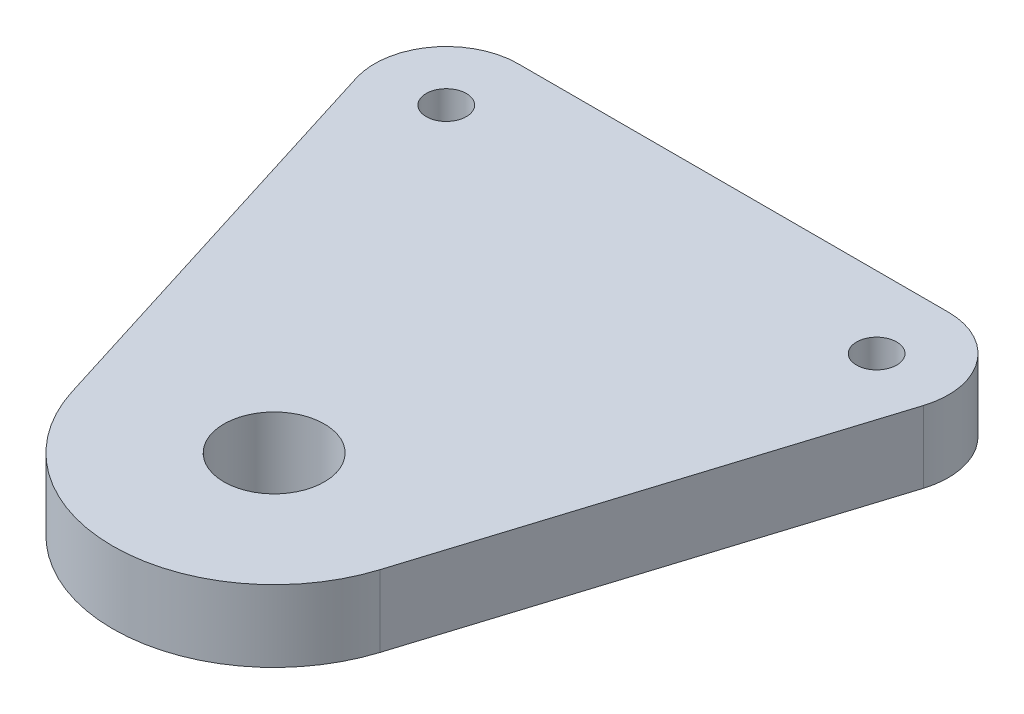
ISO-10303-21;
HEADER;
FILE_DESCRIPTION(('STEP AP214'),'2;1');
FILE_NAME('part.step','',(''),(''),'','','');
FILE_SCHEMA(('AUTOMOTIVE_DESIGN { 1 0 10303 214 1 1 1 1 }'));
ENDSEC;
DATA;
#1=APPLICATION_CONTEXT('core data for automotive mechanical design processes');
#2=APPLICATION_PROTOCOL_DEFINITION('international standard','automotive_design',2000,#1);
#3=PRODUCT_CONTEXT('',#1,'mechanical');
#4=PRODUCT('Part','Part','',(#3));
#5=PRODUCT_RELATED_PRODUCT_CATEGORY('part','',(#4));
#6=PRODUCT_DEFINITION_FORMATION('','',#4);
#7=PRODUCT_DEFINITION_CONTEXT('part definition',#1,'design');
#8=PRODUCT_DEFINITION('design','',#6,#7);
#9=PRODUCT_DEFINITION_SHAPE('','',#8);
#10=(LENGTH_UNIT() NAMED_UNIT(*) SI_UNIT(.MILLI.,.METRE.));
#11=(NAMED_UNIT(*) PLANE_ANGLE_UNIT() SI_UNIT($,.RADIAN.));
#12=(NAMED_UNIT(*) SI_UNIT($,.STERADIAN.) SOLID_ANGLE_UNIT());
#13=UNCERTAINTY_MEASURE_WITH_UNIT(LENGTH_MEASURE(1.E-05),#10,'distance_accuracy_value','');
#14=(GEOMETRIC_REPRESENTATION_CONTEXT(3) GLOBAL_UNCERTAINTY_ASSIGNED_CONTEXT((#13)) GLOBAL_UNIT_ASSIGNED_CONTEXT((#10,
#11,#12)) REPRESENTATION_CONTEXT('',''));
#15=CARTESIAN_POINT('',(0.,0.,0.));
#16=DIRECTION('',(0.,0.,1.));
#17=DIRECTION('',(1.,0.,0.));
#18=AXIS2_PLACEMENT_3D('',#15,#16,#17);
#19=CARTESIAN_POINT('',(-15.,5.,-27.));
#20=DIRECTION('',(0.,1.,0.));
#21=DIRECTION('',(0.,0.,1.));
#22=AXIS2_PLACEMENT_3D('',#19,#20,#21);
#23=PLANE('',#22);
#24=CARTESIAN_POINT('',(-15.,5.,-27.));
#25=DIRECTION('',(0.,1.,0.));
#26=DIRECTION('',(0.,0.,1.));
#27=AXIS2_PLACEMENT_3D('',#24,#25,#26);
#28=CIRCLE('',#27,1.4);
#29=CARTESIAN_POINT('',(-15.,5.,-25.6));
#30=VERTEX_POINT('',#29);
#31=EDGE_CURVE('E207',#30,#30,#28,.T.);
#32=ORIENTED_EDGE('',*,*,#31,.F.);
#33=EDGE_LOOP('',(#32));
#34=FACE_BOUND('',#33,.T.);
#35=CARTESIAN_POINT('',(-15.,5.,-27.));
#36=DIRECTION('',(0.,1.,0.));
#37=DIRECTION('',(0.,0.,1.));
#38=AXIS2_PLACEMENT_3D('',#35,#36,#37);
#39=CIRCLE('',#38,5.);
#40=CARTESIAN_POINT('',(-15.,5.,-32.));
#41=VERTEX_POINT('',#40);
#42=CARTESIAN_POINT('',(-19.7717201937673,5.,-25.5064517442033));
#43=VERTEX_POINT('',#42);
#44=EDGE_CURVE('E146',#41,#43,#39,.T.);
#45=ORIENTED_EDGE('',*,*,#44,.T.);
#46=DIRECTION('',(0.298709651159331,0.,0.954344038753463));
#47=VECTOR('',#46,1.);
#48=CARTESIAN_POINT('',(-10.7363704359765,5.,3.36048357554248));
#49=LINE('',#48,#47);
#50=CARTESIAN_POINT('',(-10.7363704359765,5.,3.36048357554247));
#51=VERTEX_POINT('',#50);
#52=EDGE_CURVE('E94',#43,#51,#49,.T.);
#53=ORIENTED_EDGE('',*,*,#52,.T.);
#54=CARTESIAN_POINT('',(0.,5.,0.));
#55=DIRECTION('',(0.,1.,0.));
#56=DIRECTION('',(0.,0.,1.));
#57=AXIS2_PLACEMENT_3D('',#54,#55,#56);
#58=CIRCLE('',#57,11.25);
#59=CARTESIAN_POINT('',(10.7363704359765,5.,3.36048357554248));
#60=VERTEX_POINT('',#59);
#61=EDGE_CURVE('E107',#51,#60,#58,.T.);
#62=ORIENTED_EDGE('',*,*,#61,.T.);
#63=DIRECTION('',(0.298709651159331,0.,-0.954344038753463));
#64=VECTOR('',#63,1.);
#65=CARTESIAN_POINT('',(19.7717201937673,5.,-25.5064517442033));
#66=LINE('',#65,#64);
#67=CARTESIAN_POINT('',(19.7717201937673,5.,-25.5064517442033));
#68=VERTEX_POINT('',#67);
#69=EDGE_CURVE('E101',#60,#68,#66,.T.);
#70=ORIENTED_EDGE('',*,*,#69,.T.);
#71=CARTESIAN_POINT('',(15.,5.,-27.));
#72=DIRECTION('',(0.,1.,0.));
#73=DIRECTION('',(0.,0.,1.));
#74=AXIS2_PLACEMENT_3D('',#71,#72,#73);
#75=CIRCLE('',#74,5.);
#76=CARTESIAN_POINT('',(15.,5.,-32.));
#77=VERTEX_POINT('',#76);
#78=EDGE_CURVE('E105',#68,#77,#75,.T.);
#79=ORIENTED_EDGE('',*,*,#78,.T.);
#80=DIRECTION('',(-1.,0.,0.));
#81=VECTOR('',#80,1.);
#82=CARTESIAN_POINT('',(-15.,5.,-32.));
#83=LINE('',#82,#81);
#84=EDGE_CURVE('E57',#77,#41,#83,.T.);
#85=ORIENTED_EDGE('',*,*,#84,.T.);
#86=EDGE_LOOP('',(#45,#53,#62,#70,#79,#85));
#87=FACE_BOUND('',#86,.T.);
#88=CARTESIAN_POINT('',(0.,5.,0.));
#89=DIRECTION('',(0.,1.,0.));
#90=DIRECTION('',(0.,0.,1.));
#91=AXIS2_PLACEMENT_3D('',#88,#89,#90);
#92=CIRCLE('',#91,3.5);
#93=CARTESIAN_POINT('',(0.,5.,3.5));
#94=VERTEX_POINT('',#93);
#95=EDGE_CURVE('E134',#94,#94,#92,.T.);
#96=ORIENTED_EDGE('',*,*,#95,.F.);
#97=EDGE_LOOP('',(#96));
#98=FACE_BOUND('',#97,.T.);
#99=CARTESIAN_POINT('',(15.,5.,-27.));
#100=DIRECTION('',(0.,1.,0.));
#101=DIRECTION('',(0.,0.,1.));
#102=AXIS2_PLACEMENT_3D('',#99,#100,#101);
#103=CIRCLE('',#102,1.4);
#104=CARTESIAN_POINT('',(15.,5.,-25.6));
#105=VERTEX_POINT('',#104);
#106=EDGE_CURVE('E196',#105,#105,#103,.T.);
#107=ORIENTED_EDGE('',*,*,#106,.F.);
#108=EDGE_LOOP('',(#107));
#109=FACE_BOUND('',#108,.T.);
#110=ADVANCED_FACE('F39',(#34,#87,#98,#109),#23,.T.);
#111=CARTESIAN_POINT('',(-15.,0.,-27.));
#112=DIRECTION('',(0.,1.,0.));
#113=DIRECTION('',(0.,0.,1.));
#114=AXIS2_PLACEMENT_3D('',#111,#112,#113);
#115=PLANE('',#114);
#116=CARTESIAN_POINT('',(-15.,0.,-27.));
#117=DIRECTION('',(0.,1.,0.));
#118=DIRECTION('',(0.,0.,1.));
#119=AXIS2_PLACEMENT_3D('',#116,#117,#118);
#120=CIRCLE('',#119,5.);
#121=CARTESIAN_POINT('',(-15.,0.,-32.));
#122=VERTEX_POINT('',#121);
#123=CARTESIAN_POINT('',(-19.7717201937673,0.,-25.5064517442033));
#124=VERTEX_POINT('',#123);
#125=EDGE_CURVE('E129',#122,#124,#120,.T.);
#126=ORIENTED_EDGE('',*,*,#125,.F.);
#127=DIRECTION('',(-1.,0.,0.));
#128=VECTOR('',#127,1.);
#129=CARTESIAN_POINT('',(-15.,0.,-32.));
#130=LINE('',#129,#128);
#131=CARTESIAN_POINT('',(15.,0.,-32.));
#132=VERTEX_POINT('',#131);
#133=EDGE_CURVE('E86',#132,#122,#130,.T.);
#134=ORIENTED_EDGE('',*,*,#133,.F.);
#135=CARTESIAN_POINT('',(15.,0.,-27.));
#136=DIRECTION('',(0.,1.,0.));
#137=DIRECTION('',(0.,0.,1.));
#138=AXIS2_PLACEMENT_3D('',#135,#136,#137);
#139=CIRCLE('',#138,5.);
#140=CARTESIAN_POINT('',(19.7717201937673,0.,-25.5064517442033));
#141=VERTEX_POINT('',#140);
#142=EDGE_CURVE('E80',#141,#132,#139,.T.);
#143=ORIENTED_EDGE('',*,*,#142,.F.);
#144=DIRECTION('',(0.298709651159331,0.,-0.954344038753463));
#145=VECTOR('',#144,1.);
#146=CARTESIAN_POINT('',(19.7717201937673,0.,-25.5064517442033));
#147=LINE('',#146,#145);
#148=CARTESIAN_POINT('',(10.7363704359765,0.,3.36048357554248));
#149=VERTEX_POINT('',#148);
#150=EDGE_CURVE('E116',#149,#141,#147,.T.);
#151=ORIENTED_EDGE('',*,*,#150,.F.);
#152=CARTESIAN_POINT('',(0.,0.,0.));
#153=DIRECTION('',(0.,1.,0.));
#154=DIRECTION('',(0.,0.,1.));
#155=AXIS2_PLACEMENT_3D('',#152,#153,#154);
#156=CIRCLE('',#155,11.25);
#157=CARTESIAN_POINT('',(-10.7363704359765,0.,3.36048357554247));
#158=VERTEX_POINT('',#157);
#159=EDGE_CURVE('E137',#158,#149,#156,.T.);
#160=ORIENTED_EDGE('',*,*,#159,.F.);
#161=DIRECTION('',(0.298709651159331,0.,0.954344038753463));
#162=VECTOR('',#161,1.);
#163=CARTESIAN_POINT('',(-10.7363704359765,0.,3.36048357554248));
#164=LINE('',#163,#162);
#165=EDGE_CURVE('E133',#124,#158,#164,.T.);
#166=ORIENTED_EDGE('',*,*,#165,.F.);
#167=EDGE_LOOP('',(#126,#134,#143,#151,#160,#166));
#168=FACE_BOUND('',#167,.T.);
#169=CARTESIAN_POINT('',(0.,0.,0.));
#170=DIRECTION('',(0.,1.,0.));
#171=DIRECTION('',(0.,0.,1.));
#172=AXIS2_PLACEMENT_3D('',#169,#170,#171);
#173=CIRCLE('',#172,3.5);
#174=CARTESIAN_POINT('',(0.,0.,3.5));
#175=VERTEX_POINT('',#174);
#176=EDGE_CURVE('E211',#175,#175,#173,.T.);
#177=ORIENTED_EDGE('',*,*,#176,.T.);
#178=EDGE_LOOP('',(#177));
#179=FACE_BOUND('',#178,.T.);
#180=CARTESIAN_POINT('',(-15.,0.,-27.));
#181=DIRECTION('',(0.,1.,0.));
#182=DIRECTION('',(0.,0.,1.));
#183=AXIS2_PLACEMENT_3D('',#180,#181,#182);
#184=CIRCLE('',#183,1.4);
#185=CARTESIAN_POINT('',(-15.,0.,-25.6));
#186=VERTEX_POINT('',#185);
#187=EDGE_CURVE('E204',#186,#186,#184,.T.);
#188=ORIENTED_EDGE('',*,*,#187,.T.);
#189=EDGE_LOOP('',(#188));
#190=FACE_BOUND('',#189,.T.);
#191=CARTESIAN_POINT('',(15.,0.,-27.));
#192=DIRECTION('',(0.,1.,0.));
#193=DIRECTION('',(0.,0.,1.));
#194=AXIS2_PLACEMENT_3D('',#191,#192,#193);
#195=CIRCLE('',#194,1.4);
#196=CARTESIAN_POINT('',(15.,0.,-25.6));
#197=VERTEX_POINT('',#196);
#198=EDGE_CURVE('E199',#197,#197,#195,.T.);
#199=ORIENTED_EDGE('',*,*,#198,.T.);
#200=EDGE_LOOP('',(#199));
#201=FACE_BOUND('',#200,.T.);
#202=ADVANCED_FACE('F159',(#168,#179,#190,#201),#115,.F.);
#203=CARTESIAN_POINT('',(-15.,5.,-27.));
#204=DIRECTION('',(0.,-1.,0.));
#205=DIRECTION('',(0.,0.,-1.));
#206=AXIS2_PLACEMENT_3D('',#203,#204,#205);
#207=CYLINDRICAL_SURFACE('',#206,5.);
#208=ORIENTED_EDGE('',*,*,#125,.T.);
#209=DIRECTION('',(0.,-1.,0.));
#210=VECTOR('',#209,1.);
#211=CARTESIAN_POINT('',(-19.7717201937673,5.,-25.5064517442033));
#212=LINE('',#211,#210);
#213=EDGE_CURVE('E11',#43,#124,#212,.T.);
#214=ORIENTED_EDGE('',*,*,#213,.F.);
#215=ORIENTED_EDGE('',*,*,#44,.F.);
#216=DIRECTION('',(0.,-1.,0.));
#217=VECTOR('',#216,1.);
#218=CARTESIAN_POINT('',(-15.,5.,-32.));
#219=LINE('',#218,#217);
#220=EDGE_CURVE('E125',#41,#122,#219,.T.);
#221=ORIENTED_EDGE('',*,*,#220,.T.);
#222=EDGE_LOOP('',(#208,#214,#215,#221));
#223=FACE_BOUND('',#222,.T.);
#224=ADVANCED_FACE('F41',(#223),#207,.T.);
#225=CARTESIAN_POINT('',(-10.7363704359765,5.,3.36048357554248));
#226=DIRECTION('',(0.954344038753463,0.,-0.298709651159331));
#227=DIRECTION('',(-0.298709651159331,0.,-0.954344038753463));
#228=AXIS2_PLACEMENT_3D('',#225,#226,#227);
#229=PLANE('',#228);
#230=ORIENTED_EDGE('',*,*,#165,.T.);
#231=DIRECTION('',(0.,-1.,0.));
#232=VECTOR('',#231,1.);
#233=CARTESIAN_POINT('',(-10.7363704359765,5.,3.36048357554247));
#234=LINE('',#233,#232);
#235=EDGE_CURVE('E49',#51,#158,#234,.T.);
#236=ORIENTED_EDGE('',*,*,#235,.F.);
#237=ORIENTED_EDGE('',*,*,#52,.F.);
#238=ORIENTED_EDGE('',*,*,#213,.T.);
#239=EDGE_LOOP('',(#230,#236,#237,#238));
#240=FACE_BOUND('',#239,.T.);
#241=ADVANCED_FACE('F267',(#240),#229,.F.);
#242=CARTESIAN_POINT('',(0.,5.,0.));
#243=DIRECTION('',(0.,-1.,0.));
#244=DIRECTION('',(0.,0.,-1.));
#245=AXIS2_PLACEMENT_3D('',#242,#243,#244);
#246=CYLINDRICAL_SURFACE('',#245,11.25);
#247=ORIENTED_EDGE('',*,*,#159,.T.);
#248=DIRECTION('',(0.,-1.,0.));
#249=VECTOR('',#248,1.);
#250=CARTESIAN_POINT('',(10.7363704359765,5.,3.36048357554248));
#251=LINE('',#250,#249);
#252=EDGE_CURVE('E118',#60,#149,#251,.T.);
#253=ORIENTED_EDGE('',*,*,#252,.F.);
#254=ORIENTED_EDGE('',*,*,#61,.F.);
#255=ORIENTED_EDGE('',*,*,#235,.T.);
#256=EDGE_LOOP('',(#247,#253,#254,#255));
#257=FACE_BOUND('',#256,.T.);
#258=ADVANCED_FACE('F156',(#257),#246,.T.);
#259=CARTESIAN_POINT('',(19.7717201937673,5.,-25.5064517442033));
#260=DIRECTION('',(-0.954344038753463,0.,-0.298709651159331));
#261=DIRECTION('',(-0.298709651159331,0.,0.954344038753463));
#262=AXIS2_PLACEMENT_3D('',#259,#260,#261);
#263=PLANE('',#262);
#264=ORIENTED_EDGE('',*,*,#150,.T.);
#265=DIRECTION('',(0.,-1.,0.));
#266=VECTOR('',#265,1.);
#267=CARTESIAN_POINT('',(19.7717201937673,5.,-25.5064517442033));
#268=LINE('',#267,#266);
#269=EDGE_CURVE('E113',#68,#141,#268,.T.);
#270=ORIENTED_EDGE('',*,*,#269,.F.);
#271=ORIENTED_EDGE('',*,*,#69,.F.);
#272=ORIENTED_EDGE('',*,*,#252,.T.);
#273=EDGE_LOOP('',(#264,#270,#271,#272));
#274=FACE_BOUND('',#273,.T.);
#275=ADVANCED_FACE('F114',(#274),#263,.F.);
#276=CARTESIAN_POINT('',(15.,5.,-27.));
#277=DIRECTION('',(0.,-1.,0.));
#278=DIRECTION('',(0.,0.,-1.));
#279=AXIS2_PLACEMENT_3D('',#276,#277,#278);
#280=CYLINDRICAL_SURFACE('',#279,5.);
#281=ORIENTED_EDGE('',*,*,#142,.T.);
#282=DIRECTION('',(0.,-1.,0.));
#283=VECTOR('',#282,1.);
#284=CARTESIAN_POINT('',(15.,5.,-32.));
#285=LINE('',#284,#283);
#286=EDGE_CURVE('E119',#77,#132,#285,.T.);
#287=ORIENTED_EDGE('',*,*,#286,.F.);
#288=ORIENTED_EDGE('',*,*,#78,.F.);
#289=ORIENTED_EDGE('',*,*,#269,.T.);
#290=EDGE_LOOP('',(#281,#287,#288,#289));
#291=FACE_BOUND('',#290,.T.);
#292=ADVANCED_FACE('F121',(#291),#280,.T.);
#293=CARTESIAN_POINT('',(-15.,5.,-32.));
#294=DIRECTION('',(0.,0.,1.));
#295=DIRECTION('',(1.,0.,0.));
#296=AXIS2_PLACEMENT_3D('',#293,#294,#295);
#297=PLANE('',#296);
#298=ORIENTED_EDGE('',*,*,#133,.T.);
#299=ORIENTED_EDGE('',*,*,#220,.F.);
#300=ORIENTED_EDGE('',*,*,#84,.F.);
#301=ORIENTED_EDGE('',*,*,#286,.T.);
#302=EDGE_LOOP('',(#298,#299,#300,#301));
#303=FACE_BOUND('',#302,.T.);
#304=ADVANCED_FACE('F164',(#303),#297,.F.);
#305=CARTESIAN_POINT('',(0.,5.,0.));
#306=DIRECTION('',(0.,-1.,0.));
#307=DIRECTION('',(0.,0.,-1.));
#308=AXIS2_PLACEMENT_3D('',#305,#306,#307);
#309=CYLINDRICAL_SURFACE('',#308,3.5);
#310=ORIENTED_EDGE('',*,*,#95,.T.);
#311=EDGE_LOOP('',(#310));
#312=FACE_BOUND('',#311,.T.);
#313=ORIENTED_EDGE('',*,*,#176,.F.);
#314=EDGE_LOOP('',(#313));
#315=FACE_BOUND('',#314,.T.);
#316=ADVANCED_FACE('F166',(#312,#315),#309,.F.);
#317=CARTESIAN_POINT('',(-15.,5.,-27.));
#318=DIRECTION('',(0.,-1.,0.));
#319=DIRECTION('',(0.,0.,-1.));
#320=AXIS2_PLACEMENT_3D('',#317,#318,#319);
#321=CYLINDRICAL_SURFACE('',#320,1.4);
#322=ORIENTED_EDGE('',*,*,#31,.T.);
#323=EDGE_LOOP('',(#322));
#324=FACE_BOUND('',#323,.T.);
#325=ORIENTED_EDGE('',*,*,#187,.F.);
#326=EDGE_LOOP('',(#325));
#327=FACE_BOUND('',#326,.T.);
#328=ADVANCED_FACE('F172',(#324,#327),#321,.F.);
#329=CARTESIAN_POINT('',(15.,5.,-27.));
#330=DIRECTION('',(0.,-1.,0.));
#331=DIRECTION('',(0.,0.,-1.));
#332=AXIS2_PLACEMENT_3D('',#329,#330,#331);
#333=CYLINDRICAL_SURFACE('',#332,1.4);
#334=ORIENTED_EDGE('',*,*,#106,.T.);
#335=EDGE_LOOP('',(#334));
#336=FACE_BOUND('',#335,.T.);
#337=ORIENTED_EDGE('',*,*,#198,.F.);
#338=EDGE_LOOP('',(#337));
#339=FACE_BOUND('',#338,.T.);
#340=ADVANCED_FACE('F187',(#336,#339),#333,.F.);
#341=CLOSED_SHELL('',(#110,#202,#224,#241,#258,#275,#292,#304,#316,#328,#340));
#342=MANIFOLD_SOLID_BREP('B2',#341);
#343=ADVANCED_BREP_SHAPE_REPRESENTATION('',(#18,#342),#14);
#344=SHAPE_DEFINITION_REPRESENTATION(#9,#343);
ENDSEC;
END-ISO-10303-21;
